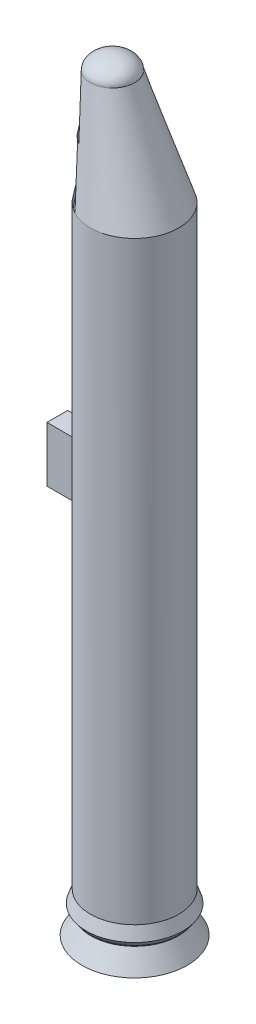
ISO-10303-21;
HEADER;
FILE_DESCRIPTION(('STEP AP214'),'2;1');
FILE_NAME('part.step','',(''),(''),'','','');
FILE_SCHEMA(('AUTOMOTIVE_DESIGN { 1 0 10303 214 1 1 1 1 }'));
ENDSEC;
DATA;
#1=APPLICATION_CONTEXT('core data for automotive mechanical design processes');
#2=APPLICATION_PROTOCOL_DEFINITION('international standard','automotive_design',2000,#1);
#3=PRODUCT_CONTEXT('',#1,'mechanical');
#4=PRODUCT('Part','Part','',(#3));
#5=PRODUCT_RELATED_PRODUCT_CATEGORY('part','',(#4));
#6=PRODUCT_DEFINITION_FORMATION('','',#4);
#7=PRODUCT_DEFINITION_CONTEXT('part definition',#1,'design');
#8=PRODUCT_DEFINITION('design','',#6,#7);
#9=PRODUCT_DEFINITION_SHAPE('','',#8);
#10=(LENGTH_UNIT() NAMED_UNIT(*) SI_UNIT(.MILLI.,.METRE.));
#11=(NAMED_UNIT(*) PLANE_ANGLE_UNIT() SI_UNIT($,.RADIAN.));
#12=(NAMED_UNIT(*) SI_UNIT($,.STERADIAN.) SOLID_ANGLE_UNIT());
#13=UNCERTAINTY_MEASURE_WITH_UNIT(LENGTH_MEASURE(1.E-05),#10,'distance_accuracy_value','');
#14=(GEOMETRIC_REPRESENTATION_CONTEXT(3) GLOBAL_UNCERTAINTY_ASSIGNED_CONTEXT((#13)) GLOBAL_UNIT_ASSIGNED_CONTEXT((#10,
#11,#12)) REPRESENTATION_CONTEXT('',''));
#15=CARTESIAN_POINT('',(0.,0.,0.));
#16=DIRECTION('',(0.,0.,1.));
#17=DIRECTION('',(1.,0.,0.));
#18=AXIS2_PLACEMENT_3D('',#15,#16,#17);
#19=CARTESIAN_POINT('',(0.,-2705.87841409681,0.));
#20=DIRECTION('',(0.,-1.,0.));
#21=DIRECTION('',(0.,0.,-1.));
#22=AXIS2_PLACEMENT_3D('',#19,#20,#21);
#23=CYLINDRICAL_SURFACE('',#22,1600.);
#24=DIRECTION('',(0.,-1.,0.));
#25=VECTOR('',#24,1.);
#26=CARTESIAN_POINT('',(-1555.43402303023,-2705.87841409681,-375.000000000003));
#27=LINE('',#26,#25);
#28=CARTESIAN_POINT('',(-1555.43402303023,14110.,-375.));
#29=VERTEX_POINT('',#28);
#30=CARTESIAN_POINT('',(-1555.43402303023,12110.,-375.000000000003));
#31=VERTEX_POINT('',#30);
#32=EDGE_CURVE('E110',#29,#31,#27,.T.);
#33=ORIENTED_EDGE('',*,*,#32,.F.);
#34=CARTESIAN_POINT('',(0.,14110.,0.));
#35=DIRECTION('',(0.,-1.,0.));
#36=DIRECTION('',(0.,0.,-1.));
#37=AXIS2_PLACEMENT_3D('',#34,#35,#36);
#38=CIRCLE('',#37,1600.);
#39=CARTESIAN_POINT('',(-1555.43402303023,14110.,375.));
#40=VERTEX_POINT('',#39);
#41=EDGE_CURVE('E112',#40,#29,#38,.T.);
#42=ORIENTED_EDGE('',*,*,#41,.F.);
#43=DIRECTION('',(0.,-1.,0.));
#44=VECTOR('',#43,1.);
#45=CARTESIAN_POINT('',(-1555.43402303023,-2705.87841409681,374.999999999996));
#46=LINE('',#45,#44);
#47=CARTESIAN_POINT('',(-1555.43402303023,12110.,374.999999999996));
#48=VERTEX_POINT('',#47);
#49=EDGE_CURVE('E88',#48,#40,#46,.F.);
#50=ORIENTED_EDGE('',*,*,#49,.F.);
#51=CARTESIAN_POINT('',(0.,12110.,0.));
#52=DIRECTION('',(0.,1.,0.));
#53=DIRECTION('',(0.,0.,1.));
#54=AXIS2_PLACEMENT_3D('',#51,#52,#53);
#55=CIRCLE('',#54,1600.);
#56=EDGE_CURVE('E82',#31,#48,#55,.T.);
#57=ORIENTED_EDGE('',*,*,#56,.F.);
#58=EDGE_LOOP('',(#33,#42,#50,#57));
#59=FACE_BOUND('',#58,.T.);
#60=CARTESIAN_POINT('',(0.,22220.,0.));
#61=DIRECTION('',(0.,1.,0.));
#62=DIRECTION('',(0.,0.,1.));
#63=AXIS2_PLACEMENT_3D('',#60,#61,#62);
#64=CIRCLE('',#63,1600.);
#65=CARTESIAN_POINT('',(0.,22220.,1600.));
#66=VERTEX_POINT('',#65);
#67=EDGE_CURVE('E142',#66,#66,#64,.F.);
#68=ORIENTED_EDGE('',*,*,#67,.T.);
#69=EDGE_LOOP('',(#68));
#70=FACE_BOUND('',#69,.T.);
#71=CARTESIAN_POINT('',(0.,700.,0.));
#72=DIRECTION('',(0.,-1.,0.));
#73=DIRECTION('',(0.,0.,-1.));
#74=AXIS2_PLACEMENT_3D('',#71,#72,#73);
#75=CIRCLE('',#74,1600.);
#76=CARTESIAN_POINT('',(0.,700.,-1600.));
#77=VERTEX_POINT('',#76);
#78=EDGE_CURVE('E71',#77,#77,#75,.T.);
#79=ORIENTED_EDGE('',*,*,#78,.F.);
#80=EDGE_LOOP('',(#79));
#81=FACE_BOUND('',#80,.T.);
#82=ADVANCED_FACE('F63',(#59,#70,#81),#23,.T.);
#83=CARTESIAN_POINT('',(0.,250.,0.));
#84=DIRECTION('',(0.,-1.,0.));
#85=DIRECTION('',(0.,0.,-1.));
#86=AXIS2_PLACEMENT_3D('',#83,#84,#85);
#87=CONICAL_SURFACE('',#86,1750.79150787814,0.323332733960273);
#88=ORIENTED_EDGE('',*,*,#78,.T.);
#89=EDGE_LOOP('',(#88));
#90=FACE_BOUND('',#89,.T.);
#91=CARTESIAN_POINT('',(0.,250.,0.));
#92=DIRECTION('',(0.,-1.,0.));
#93=DIRECTION('',(0.,0.,-1.));
#94=AXIS2_PLACEMENT_3D('',#91,#92,#93);
#95=CIRCLE('',#94,1750.79150787814);
#96=CARTESIAN_POINT('',(0.,250.,-1750.79150787814));
#97=VERTEX_POINT('',#96);
#98=EDGE_CURVE('E205',#97,#97,#95,.T.);
#99=ORIENTED_EDGE('',*,*,#98,.F.);
#100=EDGE_LOOP('',(#99));
#101=FACE_BOUND('',#100,.T.);
#102=ADVANCED_FACE('F217',(#90,#101),#87,.T.);
#103=CARTESIAN_POINT('',(0.,49.9999999999998,0.));
#104=DIRECTION('',(0.,1.,0.));
#105=DIRECTION('',(0.,0.,1.));
#106=AXIS2_PLACEMENT_3D('',#103,#104,#105);
#107=CONICAL_SURFACE('',#106,1600.,0.64602912633774);
#108=ORIENTED_EDGE('',*,*,#98,.T.);
#109=EDGE_LOOP('',(#108));
#110=FACE_BOUND('',#109,.T.);
#111=CARTESIAN_POINT('',(0.,49.9999999999998,0.));
#112=DIRECTION('',(0.,-1.,0.));
#113=DIRECTION('',(0.,0.,-1.));
#114=AXIS2_PLACEMENT_3D('',#111,#112,#113);
#115=CIRCLE('',#114,1600.);
#116=CARTESIAN_POINT('',(0.,49.9999999999998,-1600.));
#117=VERTEX_POINT('',#116);
#118=EDGE_CURVE('E199',#117,#117,#115,.T.);
#119=ORIENTED_EDGE('',*,*,#118,.F.);
#120=EDGE_LOOP('',(#119));
#121=FACE_BOUND('',#120,.T.);
#122=ADVANCED_FACE('F223',(#110,#121),#107,.T.);
#123=CARTESIAN_POINT('',(0.,0.,0.));
#124=DIRECTION('',(0.,-1.,0.));
#125=DIRECTION('',(0.,0.,-1.));
#126=AXIS2_PLACEMENT_3D('',#123,#124,#125);
#127=PLANE('',#126);
#128=CARTESIAN_POINT('',(0.,0.,0.));
#129=DIRECTION('',(0.,-1.,0.));
#130=DIRECTION('',(0.,0.,-1.));
#131=AXIS2_PLACEMENT_3D('',#128,#129,#130);
#132=CIRCLE('',#131,1475.);
#133=CARTESIAN_POINT('',(0.,0.,-1475.));
#134=VERTEX_POINT('',#133);
#135=EDGE_CURVE('E398',#134,#134,#132,.T.);
#136=ORIENTED_EDGE('',*,*,#135,.F.);
#137=EDGE_LOOP('',(#136));
#138=FACE_BOUND('',#137,.T.);
#139=CARTESIAN_POINT('',(0.,0.,0.));
#140=DIRECTION('',(0.,-1.,0.));
#141=DIRECTION('',(0.,0.,-1.));
#142=AXIS2_PLACEMENT_3D('',#139,#140,#141);
#143=CIRCLE('',#142,1550.);
#144=CARTESIAN_POINT('',(0.,0.,-1550.));
#145=VERTEX_POINT('',#144);
#146=EDGE_CURVE('E12',#145,#145,#143,.T.);
#147=ORIENTED_EDGE('',*,*,#146,.T.);
#148=EDGE_LOOP('',(#147));
#149=FACE_BOUND('',#148,.T.);
#150=ADVANCED_FACE('F168',(#138,#149),#127,.T.);
#151=CARTESIAN_POINT('',(0.,49.9999999999998,0.));
#152=DIRECTION('',(0.,-1.,0.));
#153=DIRECTION('',(0.,0.,-1.));
#154=AXIS2_PLACEMENT_3D('',#151,#152,#153);
#155=TOROIDAL_SURFACE('',#154,1550.,50.);
#156=ORIENTED_EDGE('',*,*,#118,.T.);
#157=EDGE_LOOP('',(#156));
#158=FACE_BOUND('',#157,.T.);
#159=ORIENTED_EDGE('',*,*,#146,.F.);
#160=EDGE_LOOP('',(#159));
#161=FACE_BOUND('',#160,.T.);
#162=ADVANCED_FACE('F170',(#158,#161),#155,.T.);
#163=CARTESIAN_POINT('',(-1323.00391907383,25970.,606.769768474791));
#164=CARTESIAN_POINT('',(-667.923185242013,22220.,1453.91836724631));
#165=CARTESIAN_POINT('',(-1342.86041331405,25970.,589.707856770402));
#166=CARTESIAN_POINT('',(-715.502552548891,22220.,1432.06063212215));
#167=CARTESIAN_POINT('',(-1380.89712683293,25970.0000000001,553.633200143417));
#168=CARTESIAN_POINT('',(-808.513842464645,22219.9999999999,1383.670658341));
#169=CARTESIAN_POINT('',(-1432.3732481423,25970.,494.189156202962));
#170=CARTESIAN_POINT('',(-940.24388894703,22220.0000000002,1297.75949928611));
#171=CARTESIAN_POINT('',(-1477.77507913862,25970.,429.985920217932));
#172=CARTESIAN_POINT('',(-1062.91907979896,22219.9999999998,1199.35054523821));
#173=CARTESIAN_POINT('',(-1516.66527209101,25970.,361.641617289637));
#174=CARTESIAN_POINT('',(-1175.35771397158,22220.0000000001,1089.39098983607));
#175=CARTESIAN_POINT('',(-1548.66923545024,25970.,289.814537894018));
#176=CARTESIAN_POINT('',(-1276.47704870153,22219.9999999999,968.940112528612));
#177=CARTESIAN_POINT('',(-1573.47883552455,25970.,215.19638400611));
#178=CARTESIAN_POINT('',(-1365.3031932806,22220.,839.157750653671));
#179=CARTESIAN_POINT('',(-1590.85510501869,25970.,138.505774661817));
#180=CARTESIAN_POINT('',(-1440.98073257381,22220.,701.293873167133));
#181=CARTESIAN_POINT('',(-1600.63071272861,25970.0000000001,60.4812758228407));
#182=CARTESIAN_POINT('',(-1502.78083614969,22220.,556.676131723644));
#183=CARTESIAN_POINT('',(-1602.7115085414,25969.9999999999,-18.1256900195823));
#184=CARTESIAN_POINT('',(-1550.10833795969,22220.0000000001,406.697304825093));
#185=CARTESIAN_POINT('',(-1597.07745588166,25970.0000000001,-96.5580970539306));
#186=CARTESIAN_POINT('',(-1582.50745455952,22219.9999999999,252.801750406209));
#187=CARTESIAN_POINT('',(-1583.78281203628,25969.9999999999,-174.060597062188));
#188=CARTESIAN_POINT('',(-1599.66614457045,22220.,96.4715844676204));
#189=CARTESIAN_POINT('',(-1562.95561235958,25970.0000000002,-249.886799189826));
#190=CARTESIAN_POINT('',(-1601.41920114344,22220.,-60.7876696999389));
#191=CARTESIAN_POINT('',(-1534.7964335996,25969.9999999999,-323.306455184251));
#192=CARTESIAN_POINT('',(-1587.74966249264,22220.,-217.461483935045));
#193=CARTESIAN_POINT('',(-1499.57646420522,25970.0000000001,-393.61249369531));
#194=CARTESIAN_POINT('',(-1558.78931333837,22219.9999999999,-372.041066137359));
#195=CARTESIAN_POINT('',(-1457.63489157874,25970.,-460.127828884509));
#196=CARTESIAN_POINT('',(-1514.81687282778,22220.0000000001,-523.037624825355));
#197=CARTESIAN_POINT('',(-1409.37563607487,25970.,-522.211881665703));
#198=CARTESIAN_POINT('',(-1456.25598726636,22219.9999999999,-668.997076778703));
#199=CARTESIAN_POINT('',(-1355.26346074184,25970.,-579.266748486115));
#200=CARTESIAN_POINT('',(-1383.67052003117,22220.0000000001,-808.513702530423));
#201=CARTESIAN_POINT('',(-1295.8194955049,25970.0000000001,-630.742959814528));
#202=CARTESIAN_POINT('',(-1297.75961843029,22219.9999999999,-940.243931679186));
#203=CARTESIAN_POINT('',(-1231.61621839988,25969.9999999999,-676.144771386644));
#204=CARTESIAN_POINT('',(-1199.35046939147,22220.,-1062.91906523823));
#205=CARTESIAN_POINT('',(-1163.27194214986,25970.,-715.034939253182));
#206=CARTESIAN_POINT('',(-1089.39100700119,22220.,-1175.3577466568));
#207=CARTESIAN_POINT('',(-1091.44485977547,25970.,-747.038929330553));
#208=CARTESIAN_POINT('',(-968.94006342131,22219.9999999999,-1276.47706353825));
#209=CARTESIAN_POINT('',(-1016.82670521016,25969.9999999999,-771.848526843129));
#210=CARTESIAN_POINT('',(-839.157724164818,22220.0000000001,-1365.30322044433));
#211=CARTESIAN_POINT('',(-940.136092662213,25970.0000000001,-789.224800035137));
#212=CARTESIAN_POINT('',(-701.293823566995,22219.9999999999,-1440.98075210368));
#213=CARTESIAN_POINT('',(-862.111593824051,25970.,-799.00040961184));
#214=CARTESIAN_POINT('',(-556.676088445469,22220.,-1502.78085376027));
#215=CARTESIAN_POINT('',(-783.504628951648,25970.,-801.081204804342));
#216=CARTESIAN_POINT('',(-406.697255473985,22220.,-1550.10835133461));
#217=CARTESIAN_POINT('',(-705.072222946389,25970.,-795.447158848105));
#218=CARTESIAN_POINT('',(-252.801709216952,22220.0000000001,-1582.50745820506));
#219=CARTESIAN_POINT('',(-627.569728993052,25970.,-782.152506388116));
#220=CARTESIAN_POINT('',(-96.471544574194,22219.9999999999,-1599.66615285834));
#221=CARTESIAN_POINT('',(-551.743522229413,25969.9999999999,-761.325343912189));
#222=CARTESIAN_POINT('',(60.7876911866773,22220.,-1601.41918760207));
#223=CARTESIAN_POINT('',(-478.323860209735,25970.0000000001,-733.166121450309));
#224=CARTESIAN_POINT('',(217.461507755051,22220.0000000001,-1587.7496823047));
#225=CARTESIAN_POINT('',(-408.01781170337,25969.9999999999,-697.946171801049));
#226=CARTESIAN_POINT('',(372.041048221497,22219.9999999999,-1558.78927789391));
#227=CARTESIAN_POINT('',(-341.502475055623,25970.0000000001,-656.004586008936));
#228=CARTESIAN_POINT('',(523.037631451011,22220.0000000001,-1514.81688731643));
#229=CARTESIAN_POINT('',(-279.418419747624,25970.,-607.745334848285));
#230=CARTESIAN_POINT('',(668.997071088862,22219.9999999999,-1456.2559749107));
#231=CARTESIAN_POINT('',(-222.363556820141,25970.,-553.633156344726));
#232=CARTESIAN_POINT('',(808.513709233005,22220.0000000001,-1383.67053448255));
#233=CARTESIAN_POINT('',(-170.887332284031,25970.,-494.189191675241));
#234=CARTESIAN_POINT('',(940.243916416002,22220.,-1297.75958177217));
#235=CARTESIAN_POINT('',(-125.485538682013,25970.0000000001,-429.985901669232));
#236=CARTESIAN_POINT('',(1062.91906484235,22220.,-1199.35050031608));
#237=CARTESIAN_POINT('',(-86.5953267858726,25970.,-361.641626126838));
#238=CARTESIAN_POINT('',(1175.35772221121,22220.0000000001,-1089.39101458493));
#239=CARTESIAN_POINT('',(-54.5913726386099,25970.,-289.814533411751));
#240=CARTESIAN_POINT('',(1276.47704416166,22220.,-968.940098892312));
#241=CARTESIAN_POINT('',(-29.7817677951699,25970.0000000001,-215.196386419681));
#242=CARTESIAN_POINT('',(1365.30319577597,22220.,-839.157758148951));
#243=CARTESIAN_POINT('',(-12.405500880762,25970.,-138.50577334526));
#244=CARTESIAN_POINT('',(1440.98073120616,22220.,-701.293869059142));
#245=CARTESIAN_POINT('',(-2.62989176322758,25970.,-60.4812765415939));
#246=CARTESIAN_POINT('',(1502.7808368971,22220.,-556.676133968574));
#247=CARTESIAN_POINT('',(-0.549096718415021,25970.,18.1256904112394));
#248=CARTESIAN_POINT('',(1550.10833755241,22220.,-406.697303601867));
#249=CARTESIAN_POINT('',(-6.1831489599682,25970.0000000001,96.5580968409943));
#250=CARTESIAN_POINT('',(1582.50745478079,22219.9999999999,-252.801751070546));
#251=CARTESIAN_POINT('',(-19.4777930326298,25969.9999999999,174.060597177755));
#252=CARTESIAN_POINT('',(1599.6661444507,22220.0000000001,-96.4715841084307));
#253=CARTESIAN_POINT('',(-40.3049925858399,25970.0000000001,249.886799127088));
#254=CARTESIAN_POINT('',(1601.4192012078,22219.9999999998,60.7876695075701));
#255=CARTESIAN_POINT('',(-68.4641714132969,25969.9999999999,323.306455218563));
#256=CARTESIAN_POINT('',(1587.74966245866,22220.0000000003,217.461484035371));
#257=CARTESIAN_POINT('',(-103.684140769882,25970.0000000001,393.612493675967));
#258=CARTESIAN_POINT('',(1558.78931335529,22219.9999999997,372.041066089678));
#259=CARTESIAN_POINT('',(-145.625713419366,25969.9999999999,460.127828896552));
#260=CARTESIAN_POINT('',(1514.81687281675,22220.0000000003,523.037624853606));
#261=CARTESIAN_POINT('',(-193.884968905854,25970.,522.211881656155));
#262=CARTESIAN_POINT('',(1456.25598727675,22219.9999999998,668.997076756061));
#263=CARTESIAN_POINT('',(-247.997144257611,25970.,579.266748497008));
#264=CARTESIAN_POINT('',(1383.67052001693,22220.0000000002,808.513702557195));
#265=CARTESIAN_POINT('',(-307.44110946699,25969.9999999999,630.74295979794));
#266=CARTESIAN_POINT('',(1297.75961845543,22219.9999999999,940.243931635273));
#267=CARTESIAN_POINT('',(-371.644386619359,25970.0000000001,676.144771415506));
#268=CARTESIAN_POINT('',(1199.3504693375,22220.0000000001,1062.91906532937));
#269=CARTESIAN_POINT('',(-439.988662783596,25969.9999999999,715.034939200718));
#270=CARTESIAN_POINT('',(1089.3910071052,22219.9999999999,1175.35774648264));
#271=CARTESIAN_POINT('',(-511.815745315674,25970.0000000001,747.038929427031));
#272=CARTESIAN_POINT('',(968.940063226818,22220.0000000001,1276.4770638631));
#273=CARTESIAN_POINT('',(-586.433899590431,25969.9999999998,771.848526665455));
#274=CARTESIAN_POINT('',(839.157724524679,22220.,1365.30321984366));
#275=CARTESIAN_POINT('',(-663.124512673144,25970.0000000001,789.224800361893));
#276=CARTESIAN_POINT('',(701.293822904291,22220.,1440.98075320958));
#277=CARTESIAN_POINT('',(-741.14901052914,25969.9999999999,799.000409012219));
#278=CARTESIAN_POINT('',(556.676089661721,22220.0000000001,1502.78085173071));
#279=CARTESIAN_POINT('',(-819.755977201777,25970.0000000001,801.081205902671));
#280=CARTESIAN_POINT('',(406.697253248336,22220.,1550.10835504844));
#281=CARTESIAN_POINT('',(-898.188379907746,25969.9999999999,795.447156834602));
#282=CARTESIAN_POINT('',(252.801713277786,22220.0000000001,1582.50745142895));
#283=CARTESIAN_POINT('',(-975.690879960436,25970.0000000001,782.152510127439));
#284=CARTESIAN_POINT('',(96.4715371862393,22219.9999999999,1599.66616518624));
#285=CARTESIAN_POINT('',(-1051.51707494306,25969.9999999999,761.325336539524));
#286=CARTESIAN_POINT('',(-60.7876777781402,22220.0000000001,1601.41916522779));
#287=CARTESIAN_POINT('',(-1124.93676118499,25970.0000000002,733.166136927942));
#288=CARTESIAN_POINT('',(-217.461532092655,22219.9999999999,1587.74972291724));
#289=CARTESIAN_POINT('',(-1195.24276191488,25969.9999999998,697.946142178682));
#290=CARTESIAN_POINT('',(-372.041003536405,22220.0000000001,1558.78920331686));
#291=CARTESIAN_POINT('',(-1261.75816139163,25970.0000000001,656.004670369747));
#292=CARTESIAN_POINT('',(-523.037638623379,22219.9999999999,1514.81706908592));
#293=CARTESIAN_POINT('',(-1303.14742483361,25970.,623.831680179179));
#294=CARTESIAN_POINT('',(-620.343817935136,22220.,1475.77610237046));
#295=CARTESIAN_POINT('',(-1323.00391907383,25970.,606.769768474791));
#296=CARTESIAN_POINT('',(-667.923185242013,22220.,1453.91836724631));
#297=B_SPLINE_SURFACE_WITH_KNOTS('',3,1,((#163,#164),(#165,#166),(#167,#168),(#169,#170),(#171,
#172),(#173,#174),(#175,#176),(#177,#178),(#179,#180),(#181,#182),(#183,#184),(#185,#186),(#187,
#188),(#189,#190),(#191,#192),(#193,#194),(#195,#196),(#197,#198),(#199,#200),(#201,#202),(#203,
#204),(#205,#206),(#207,#208),(#209,#210),(#211,#212),(#213,#214),(#215,#216),(#217,#218),(#219,
#220),(#221,#222),(#223,#224),(#225,#226),(#227,#228),(#229,#230),(#231,#232),(#233,#234),(#235,
#236),(#237,#238),(#239,#240),(#241,#242),(#243,#244),(#245,#246),(#247,#248),(#249,#250),(#251,
#252),(#253,#254),(#255,#256),(#257,#258),(#259,#260),(#261,#262),(#263,#264),(#265,#266),(#267,
#268),(#269,#270),(#271,#272),(#273,#274),(#275,#276),(#277,#278),(#279,#280),(#281,#282),(#283,
#284),(#285,#286),(#287,#288),(#289,#290),(#291,#292),(#293,#294),(#295,#296)),.UNSPECIFIED.,
.T.,.F.,.F.,(4,1,1,1,1,1,1,1,1,1,1,1,1,1,1,1,1,1,1,1,1,1,1,1,1,1,1,1,1,1,1,1,1,1,1,1,1,1,1,1,1,
1,1,1,1,1,1,1,1,1,1,1,1,1,1,1,1,1,1,1,1,1,1,1,4),(2,2),(0.,0.015625,0.03125,0.046875,0.0625,
0.078125,0.09375,0.109375,0.125,0.140625,0.15625,0.171875,0.1875,0.203125,0.21875,0.234375,0.25,
0.265625,0.28125,0.296875,0.3125,0.328125,0.34375,0.359375,0.375,0.390625,0.40625,0.421875,
0.4375,0.453125,0.46875,0.484375,0.5,0.515625,0.53125,0.546875,0.5625,0.578125,0.59375,0.609375,
0.625,0.640625,0.65625,0.671875,0.6875,0.703125,0.71875,0.734375,0.75,0.765625,0.78125,0.796875,
0.8125,0.828125,0.84375,0.859375,0.875,0.890625,0.90625,0.921875,0.9375,0.953125,0.96875,
0.984375,1.),(0.,1.),.UNSPECIFIED.);
#298=CARTESIAN_POINT('',(-1323.00391907383,25970.,606.769768474791));
#299=CARTESIAN_POINT('',(-1342.86041331405,25970.,589.707856770402));
#300=CARTESIAN_POINT('',(-1380.89712683293,25970.0000000001,553.633200143417));
#301=CARTESIAN_POINT('',(-1432.3732481423,25970.,494.189156202962));
#302=CARTESIAN_POINT('',(-1477.77507913862,25970.,429.985920217932));
#303=CARTESIAN_POINT('',(-1516.66527209101,25970.,361.641617289637));
#304=CARTESIAN_POINT('',(-1548.66923545024,25970.,289.814537894018));
#305=CARTESIAN_POINT('',(-1573.47883552455,25970.,215.19638400611));
#306=CARTESIAN_POINT('',(-1590.85510501869,25970.,138.505774661817));
#307=CARTESIAN_POINT('',(-1600.63071272861,25970.0000000001,60.4812758228407));
#308=CARTESIAN_POINT('',(-1602.7115085414,25969.9999999999,-18.1256900195823));
#309=CARTESIAN_POINT('',(-1597.07745588166,25970.0000000001,-96.5580970539306));
#310=CARTESIAN_POINT('',(-1583.78281203628,25969.9999999999,-174.060597062188));
#311=CARTESIAN_POINT('',(-1562.95561235958,25970.0000000002,-249.886799189826));
#312=CARTESIAN_POINT('',(-1534.7964335996,25969.9999999999,-323.306455184251));
#313=CARTESIAN_POINT('',(-1499.57646420522,25970.0000000001,-393.61249369531));
#314=CARTESIAN_POINT('',(-1457.63489157874,25970.,-460.127828884509));
#315=CARTESIAN_POINT('',(-1409.37563607487,25970.,-522.211881665703));
#316=CARTESIAN_POINT('',(-1355.26346074184,25970.,-579.266748486115));
#317=CARTESIAN_POINT('',(-1295.8194955049,25970.0000000001,-630.742959814528));
#318=CARTESIAN_POINT('',(-1231.61621839988,25969.9999999999,-676.144771386644));
#319=CARTESIAN_POINT('',(-1163.27194214986,25970.,-715.034939253182));
#320=CARTESIAN_POINT('',(-1091.44485977547,25970.,-747.038929330553));
#321=CARTESIAN_POINT('',(-1016.82670521016,25969.9999999999,-771.848526843129));
#322=CARTESIAN_POINT('',(-940.136092662213,25970.0000000001,-789.224800035137));
#323=CARTESIAN_POINT('',(-862.111593824051,25970.,-799.00040961184));
#324=CARTESIAN_POINT('',(-783.504628951648,25970.,-801.081204804342));
#325=CARTESIAN_POINT('',(-705.072222946389,25970.,-795.447158848105));
#326=CARTESIAN_POINT('',(-627.569728993052,25970.,-782.152506388116));
#327=CARTESIAN_POINT('',(-551.743522229413,25969.9999999999,-761.325343912189));
#328=CARTESIAN_POINT('',(-478.323860209735,25970.0000000001,-733.166121450309));
#329=CARTESIAN_POINT('',(-408.01781170337,25969.9999999999,-697.946171801049));
#330=CARTESIAN_POINT('',(-341.502475055623,25970.0000000001,-656.004586008936));
#331=CARTESIAN_POINT('',(-279.418419747624,25970.,-607.745334848285));
#332=CARTESIAN_POINT('',(-222.363556820141,25970.,-553.633156344726));
#333=CARTESIAN_POINT('',(-170.887332284031,25970.,-494.189191675241));
#334=CARTESIAN_POINT('',(-125.485538682013,25970.0000000001,-429.985901669232));
#335=CARTESIAN_POINT('',(-86.5953267858726,25970.,-361.641626126838));
#336=CARTESIAN_POINT('',(-54.5913726386099,25970.,-289.814533411751));
#337=CARTESIAN_POINT('',(-29.7817677951699,25970.0000000001,-215.196386419681));
#338=CARTESIAN_POINT('',(-12.405500880762,25970.,-138.50577334526));
#339=CARTESIAN_POINT('',(-2.62989176322758,25970.,-60.4812765415939));
#340=CARTESIAN_POINT('',(-0.549096718415021,25970.,18.1256904112394));
#341=CARTESIAN_POINT('',(-6.1831489599682,25970.0000000001,96.5580968409943));
#342=CARTESIAN_POINT('',(-19.4777930326298,25969.9999999999,174.060597177755));
#343=CARTESIAN_POINT('',(-40.3049925858399,25970.0000000001,249.886799127088));
#344=CARTESIAN_POINT('',(-68.4641714132969,25969.9999999999,323.306455218563));
#345=CARTESIAN_POINT('',(-103.684140769882,25970.0000000001,393.612493675967));
#346=CARTESIAN_POINT('',(-145.625713419366,25969.9999999999,460.127828896552));
#347=CARTESIAN_POINT('',(-193.884968905854,25970.,522.211881656155));
#348=CARTESIAN_POINT('',(-247.997144257611,25970.,579.266748497008));
#349=CARTESIAN_POINT('',(-307.44110946699,25969.9999999999,630.74295979794));
#350=CARTESIAN_POINT('',(-371.644386619359,25970.0000000001,676.144771415506));
#351=CARTESIAN_POINT('',(-439.988662783596,25969.9999999999,715.034939200718));
#352=CARTESIAN_POINT('',(-511.815745315674,25970.0000000001,747.038929427031));
#353=CARTESIAN_POINT('',(-586.433899590431,25969.9999999998,771.848526665455));
#354=CARTESIAN_POINT('',(-663.124512673144,25970.0000000001,789.224800361893));
#355=CARTESIAN_POINT('',(-741.14901052914,25969.9999999999,799.000409012219));
#356=CARTESIAN_POINT('',(-819.755977201777,25970.0000000001,801.081205902671));
#357=CARTESIAN_POINT('',(-898.188379907746,25969.9999999999,795.447156834602));
#358=CARTESIAN_POINT('',(-975.690879960436,25970.0000000001,782.152510127439));
#359=CARTESIAN_POINT('',(-1051.51707494306,25969.9999999999,761.325336539524));
#360=CARTESIAN_POINT('',(-1124.93676118499,25970.0000000002,733.166136927942));
#361=CARTESIAN_POINT('',(-1195.24276191488,25969.9999999998,697.946142178682));
#362=CARTESIAN_POINT('',(-1261.75816139163,25970.0000000001,656.004670369747));
#363=CARTESIAN_POINT('',(-1303.14742483361,25970.,623.831680179179));
#364=CARTESIAN_POINT('',(-1323.00391907383,25970.,606.769768474791));
#365=B_SPLINE_CURVE_WITH_KNOTS('',3,(#298,#299,#300,#301,#302,#303,#304,#305,#306,#307,#308,
#309,#310,#311,#312,#313,#314,#315,#316,#317,#318,#319,#320,#321,#322,#323,#324,#325,#326,#327,
#328,#329,#330,#331,#332,#333,#334,#335,#336,#337,#338,#339,#340,#341,#342,#343,#344,#345,#346,
#347,#348,#349,#350,#351,#352,#353,#354,#355,#356,#357,#358,#359,#360,#361,#362,#363,#364),
.UNSPECIFIED.,.T.,.F.,(4,1,1,1,1,1,1,1,1,1,1,1,1,1,1,1,1,1,1,1,1,1,1,1,1,1,1,1,1,1,1,1,1,1,1,1,
1,1,1,1,1,1,1,1,1,1,1,1,1,1,1,1,1,1,1,1,1,1,1,1,1,1,1,1,4),(0.,0.015625,0.03125,0.046875,0.0625,
0.078125,0.09375,0.109375,0.125,0.140625,0.15625,0.171875,0.1875,0.203125,0.21875,0.234375,0.25,
0.265625,0.28125,0.296875,0.3125,0.328125,0.34375,0.359375,0.375,0.390625,0.40625,0.421875,
0.4375,0.453125,0.46875,0.484375,0.5,0.515625,0.53125,0.546875,0.5625,0.578125,0.59375,0.609375,
0.625,0.640625,0.65625,0.671875,0.6875,0.703125,0.71875,0.734375,0.75,0.765625,0.78125,0.796875,
0.8125,0.828125,0.84375,0.859375,0.875,0.890625,0.90625,0.921875,0.9375,0.953125,0.96875,
0.984375,1.),.UNSPECIFIED.);
#366=CARTESIAN_POINT('',(-801.630302139193,25970.,800.000005658275));
#367=VERTEX_POINT('',#366);
#368=EDGE_CURVE('E194',#367,#367,#365,.T.);
#369=ORIENTED_EDGE('',*,*,#368,.T.);
#370=EDGE_LOOP('',(#369));
#371=FACE_BOUND('',#370,.T.);
#372=ORIENTED_EDGE('',*,*,#67,.F.);
#373=EDGE_LOOP('',(#372));
#374=FACE_BOUND('',#373,.T.);
#375=ADVANCED_FACE('F154',(#371,#374),#297,.T.);
#376=CARTESIAN_POINT('',(-801.630302494464,25970.,0.));
#377=DIRECTION('',(1.,0.,0.));
#378=DIRECTION('',(0.,0.,1.));
#379=AXIS2_PLACEMENT_3D('',#376,#377,#378);
#380=ELLIPSE('',#379,800.,500.);
#381=TRIMMED_CURVE('',#380,(PARAMETER_VALUE(4.71238898038469)),
(PARAMETER_VALUE(7.85398163397448)),.T.,.PARAMETER.);
#382=CARTESIAN_POINT('',(-801.630302494464,25470.,0.));
#383=DIRECTION('',(0.,1.,0.));
#384=AXIS1_PLACEMENT('',#382,#383);
#385=SURFACE_OF_REVOLUTION('',#381,#384);
#386=CARTESIAN_POINT('',(-801.630302494464,26470.,-1.46957615897682E-13));
#387=VERTEX_POINT('',#386);
#388=VERTEX_LOOP('',#387);
#389=FACE_BOUND('',#388,.T.);
#390=ORIENTED_EDGE('',*,*,#368,.F.);
#391=EDGE_LOOP('',(#390));
#392=FACE_BOUND('',#391,.T.);
#393=ADVANCED_FACE('F61',(#389,#392),#385,.F.);
#394=CARTESIAN_POINT('',(-2800.,12110.,-375.));
#395=DIRECTION('',(0.,0.,-1.));
#396=DIRECTION('',(0.,1.,0.));
#397=AXIS2_PLACEMENT_3D('',#394,#395,#396);
#398=PLANE('',#397);
#399=DIRECTION('',(1.,0.,0.));
#400=VECTOR('',#399,1.);
#401=CARTESIAN_POINT('',(-2800.,14110.,-375.));
#402=LINE('',#401,#400);
#403=CARTESIAN_POINT('',(-2800.,14110.,-375.));
#404=VERTEX_POINT('',#403);
#405=EDGE_CURVE('E117',#404,#29,#402,.T.);
#406=ORIENTED_EDGE('',*,*,#405,.T.);
#407=ORIENTED_EDGE('',*,*,#32,.T.);
#408=DIRECTION('',(1.,0.,0.));
#409=VECTOR('',#408,1.);
#410=CARTESIAN_POINT('',(-2800.,12110.,-375.));
#411=LINE('',#410,#409);
#412=CARTESIAN_POINT('',(-2800.,12110.,-375.));
#413=VERTEX_POINT('',#412);
#414=EDGE_CURVE('E138',#413,#31,#411,.T.);
#415=ORIENTED_EDGE('',*,*,#414,.F.);
#416=DIRECTION('',(0.,1.,0.));
#417=VECTOR('',#416,1.);
#418=CARTESIAN_POINT('',(-2800.,12110.,-375.));
#419=LINE('',#418,#417);
#420=EDGE_CURVE('E119',#413,#404,#419,.T.);
#421=ORIENTED_EDGE('',*,*,#420,.T.);
#422=EDGE_LOOP('',(#406,#407,#415,#421));
#423=FACE_BOUND('',#422,.T.);
#424=ADVANCED_FACE('F120',(#423),#398,.T.);
#425=CARTESIAN_POINT('',(-2800.,12110.,375.));
#426=DIRECTION('',(0.,-1.,0.));
#427=DIRECTION('',(0.,0.,-1.));
#428=AXIS2_PLACEMENT_3D('',#425,#426,#427);
#429=PLANE('',#428);
#430=ORIENTED_EDGE('',*,*,#56,.T.);
#431=DIRECTION('',(1.,0.,0.));
#432=VECTOR('',#431,1.);
#433=CARTESIAN_POINT('',(-2800.,12110.,375.));
#434=LINE('',#433,#432);
#435=CARTESIAN_POINT('',(-2800.,12110.,375.));
#436=VERTEX_POINT('',#435);
#437=EDGE_CURVE('E141',#436,#48,#434,.T.);
#438=ORIENTED_EDGE('',*,*,#437,.F.);
#439=DIRECTION('',(0.,0.,-1.));
#440=VECTOR('',#439,1.);
#441=CARTESIAN_POINT('',(-2800.,12110.,375.));
#442=LINE('',#441,#440);
#443=EDGE_CURVE('E121',#436,#413,#442,.T.);
#444=ORIENTED_EDGE('',*,*,#443,.T.);
#445=ORIENTED_EDGE('',*,*,#414,.T.);
#446=EDGE_LOOP('',(#430,#438,#444,#445));
#447=FACE_BOUND('',#446,.T.);
#448=ADVANCED_FACE('F288',(#447),#429,.T.);
#449=CARTESIAN_POINT('',(-2800.,12110.,375.));
#450=DIRECTION('',(0.,0.,1.));
#451=DIRECTION('',(0.,-1.,0.));
#452=AXIS2_PLACEMENT_3D('',#449,#450,#451);
#453=PLANE('',#452);
#454=ORIENTED_EDGE('',*,*,#437,.T.);
#455=ORIENTED_EDGE('',*,*,#49,.T.);
#456=DIRECTION('',(1.,0.,0.));
#457=VECTOR('',#456,1.);
#458=CARTESIAN_POINT('',(-2800.,14110.,375.));
#459=LINE('',#458,#457);
#460=CARTESIAN_POINT('',(-2800.,14110.,375.));
#461=VERTEX_POINT('',#460);
#462=EDGE_CURVE('E125',#461,#40,#459,.T.);
#463=ORIENTED_EDGE('',*,*,#462,.F.);
#464=DIRECTION('',(0.,-1.,0.));
#465=VECTOR('',#464,1.);
#466=CARTESIAN_POINT('',(-2800.,12110.,375.));
#467=LINE('',#466,#465);
#468=EDGE_CURVE('E131',#461,#436,#467,.T.);
#469=ORIENTED_EDGE('',*,*,#468,.T.);
#470=EDGE_LOOP('',(#454,#455,#463,#469));
#471=FACE_BOUND('',#470,.T.);
#472=ADVANCED_FACE('F298',(#471),#453,.T.);
#473=CARTESIAN_POINT('',(-2800.,14110.,375.));
#474=DIRECTION('',(0.,1.,0.));
#475=DIRECTION('',(0.,0.,1.));
#476=AXIS2_PLACEMENT_3D('',#473,#474,#475);
#477=PLANE('',#476);
#478=ORIENTED_EDGE('',*,*,#462,.T.);
#479=ORIENTED_EDGE('',*,*,#41,.T.);
#480=ORIENTED_EDGE('',*,*,#405,.F.);
#481=DIRECTION('',(0.,0.,1.));
#482=VECTOR('',#481,1.);
#483=CARTESIAN_POINT('',(-2800.,14110.,375.));
#484=LINE('',#483,#482);
#485=EDGE_CURVE('E133',#404,#461,#484,.T.);
#486=ORIENTED_EDGE('',*,*,#485,.T.);
#487=EDGE_LOOP('',(#478,#479,#480,#486));
#488=FACE_BOUND('',#487,.T.);
#489=ADVANCED_FACE('F127',(#488),#477,.T.);
#490=CARTESIAN_POINT('',(-2800.,0.,0.));
#491=DIRECTION('',(-1.,0.,0.));
#492=DIRECTION('',(0.,0.,1.));
#493=AXIS2_PLACEMENT_3D('',#490,#491,#492);
#494=PLANE('',#493);
#495=ORIENTED_EDGE('',*,*,#420,.F.);
#496=ORIENTED_EDGE('',*,*,#443,.F.);
#497=ORIENTED_EDGE('',*,*,#468,.F.);
#498=ORIENTED_EDGE('',*,*,#485,.F.);
#499=EDGE_LOOP('',(#495,#496,#497,#498));
#500=FACE_BOUND('',#499,.T.);
#501=ADVANCED_FACE('F320',(#500),#494,.T.);
#502=CARTESIAN_POINT('',(0.,0.,0.));
#503=DIRECTION('',(0.,-1.,0.));
#504=DIRECTION('',(0.,0.,-1.));
#505=AXIS2_PLACEMENT_3D('',#502,#503,#504);
#506=CONICAL_SURFACE('',#505,1475.,0.5235987755983);
#507=CARTESIAN_POINT('',(0.,-750.,0.));
#508=DIRECTION('',(0.,-1.,0.));
#509=DIRECTION('',(0.,0.,-1.));
#510=AXIS2_PLACEMENT_3D('',#507,#508,#509);
#511=CIRCLE('',#510,1908.01270189222);
#512=CARTESIAN_POINT('',(0.,-750.,-1908.01270189222));
#513=VERTEX_POINT('',#512);
#514=EDGE_CURVE('E126',#513,#513,#511,.T.);
#515=ORIENTED_EDGE('',*,*,#514,.F.);
#516=EDGE_LOOP('',(#515));
#517=FACE_BOUND('',#516,.T.);
#518=ORIENTED_EDGE('',*,*,#135,.T.);
#519=EDGE_LOOP('',(#518));
#520=FACE_BOUND('',#519,.T.);
#521=ADVANCED_FACE('F322',(#517,#520),#506,.T.);
#522=CARTESIAN_POINT('',(0.,-750.,0.));
#523=DIRECTION('',(0.,-1.,0.));
#524=DIRECTION('',(0.,0.,-1.));
#525=AXIS2_PLACEMENT_3D('',#522,#523,#524);
#526=PLANE('',#525);
#527=CARTESIAN_POINT('',(0.,-750.,0.));
#528=DIRECTION('',(0.,-1.,0.));
#529=DIRECTION('',(0.,0.,-1.));
#530=AXIS2_PLACEMENT_3D('',#527,#528,#529);
#531=CIRCLE('',#530,1750.);
#532=CARTESIAN_POINT('',(0.,-750.,-1750.));
#533=VERTEX_POINT('',#532);
#534=EDGE_CURVE('E386',#533,#533,#531,.T.);
#535=ORIENTED_EDGE('',*,*,#534,.F.);
#536=EDGE_LOOP('',(#535));
#537=FACE_BOUND('',#536,.T.);
#538=ORIENTED_EDGE('',*,*,#514,.T.);
#539=EDGE_LOOP('',(#538));
#540=FACE_BOUND('',#539,.T.);
#541=ADVANCED_FACE('F334',(#537,#540),#526,.T.);
#542=CARTESIAN_POINT('',(0.,-750.,0.));
#543=DIRECTION('',(0.,-1.,0.));
#544=DIRECTION('',(0.,0.,-1.));
#545=AXIS2_PLACEMENT_3D('',#542,#543,#544);
#546=CONICAL_SURFACE('',#545,1750.,0.5235987755983);
#547=CARTESIAN_POINT('',(0.,0.,0.));
#548=DIRECTION('',(0.,-1.,0.));
#549=DIRECTION('',(0.,0.,-1.));
#550=AXIS2_PLACEMENT_3D('',#547,#548,#549);
#551=CIRCLE('',#550,1316.98729810778);
#552=CARTESIAN_POINT('',(0.,0.,-1316.98729810778));
#553=VERTEX_POINT('',#552);
#554=EDGE_CURVE('E393',#553,#553,#551,.T.);
#555=ORIENTED_EDGE('',*,*,#554,.F.);
#556=EDGE_LOOP('',(#555));
#557=FACE_BOUND('',#556,.T.);
#558=ORIENTED_EDGE('',*,*,#534,.T.);
#559=EDGE_LOOP('',(#558));
#560=FACE_BOUND('',#559,.T.);
#561=ADVANCED_FACE('F345',(#557,#560),#546,.F.);
#562=CARTESIAN_POINT('',(0.,0.,0.));
#563=DIRECTION('',(0.,-1.,0.));
#564=DIRECTION('',(0.,0.,-1.));
#565=AXIS2_PLACEMENT_3D('',#562,#563,#564);
#566=PLANE('',#565);
#567=CARTESIAN_POINT('',(0.,0.,0.));
#568=DIRECTION('',(0.,-1.,0.));
#569=DIRECTION('',(0.,0.,-1.));
#570=AXIS2_PLACEMENT_3D('',#567,#568,#569);
#571=CIRCLE('',#570,1250.);
#572=CARTESIAN_POINT('',(0.,0.,-1250.));
#573=VERTEX_POINT('',#572);
#574=EDGE_CURVE('E388',#573,#573,#571,.T.);
#575=ORIENTED_EDGE('',*,*,#574,.F.);
#576=EDGE_LOOP('',(#575));
#577=FACE_BOUND('',#576,.T.);
#578=ORIENTED_EDGE('',*,*,#554,.T.);
#579=EDGE_LOOP('',(#578));
#580=FACE_BOUND('',#579,.T.);
#581=ADVANCED_FACE('F353',(#577,#580),#566,.T.);
#582=CARTESIAN_POINT('',(0.,22650.,0.));
#583=DIRECTION('',(0.,-1.,0.));
#584=DIRECTION('',(0.,0.,-1.));
#585=AXIS2_PLACEMENT_3D('',#582,#583,#584);
#586=CYLINDRICAL_SURFACE('',#585,1250.);
#587=CARTESIAN_POINT('',(0.,22650.,0.));
#588=DIRECTION('',(0.,-1.,0.));
#589=DIRECTION('',(0.,0.,-1.));
#590=AXIS2_PLACEMENT_3D('',#587,#588,#589);
#591=CIRCLE('',#590,1250.);
#592=CARTESIAN_POINT('',(0.,22650.,-1250.));
#593=VERTEX_POINT('',#592);
#594=EDGE_CURVE('E389',#593,#593,#591,.T.);
#595=ORIENTED_EDGE('',*,*,#594,.F.);
#596=EDGE_LOOP('',(#595));
#597=FACE_BOUND('',#596,.T.);
#598=ORIENTED_EDGE('',*,*,#574,.T.);
#599=EDGE_LOOP('',(#598));
#600=FACE_BOUND('',#599,.T.);
#601=ADVANCED_FACE('F361',(#597,#600),#586,.F.);
#602=CARTESIAN_POINT('',(0.,22650.,0.));
#603=DIRECTION('',(0.,-1.,0.));
#604=DIRECTION('',(0.,0.,-1.));
#605=AXIS2_PLACEMENT_3D('',#602,#603,#604);
#606=PLANE('',#605);
#607=ORIENTED_EDGE('',*,*,#594,.T.);
#608=EDGE_LOOP('',(#607));
#609=FACE_BOUND('',#608,.T.);
#610=ADVANCED_FACE('F373',(#609),#606,.T.);
#611=CLOSED_SHELL('',(#82,#102,#122,#150,#162,#375,#393,#424,#448,#472,#489,#501,#521,#541,#561,
#581,#601,#610));
#612=MANIFOLD_SOLID_BREP('B2',#611);
#613=ADVANCED_BREP_SHAPE_REPRESENTATION('',(#18,#612),#14);
#614=SHAPE_DEFINITION_REPRESENTATION(#9,#613);
ENDSEC;
END-ISO-10303-21;
